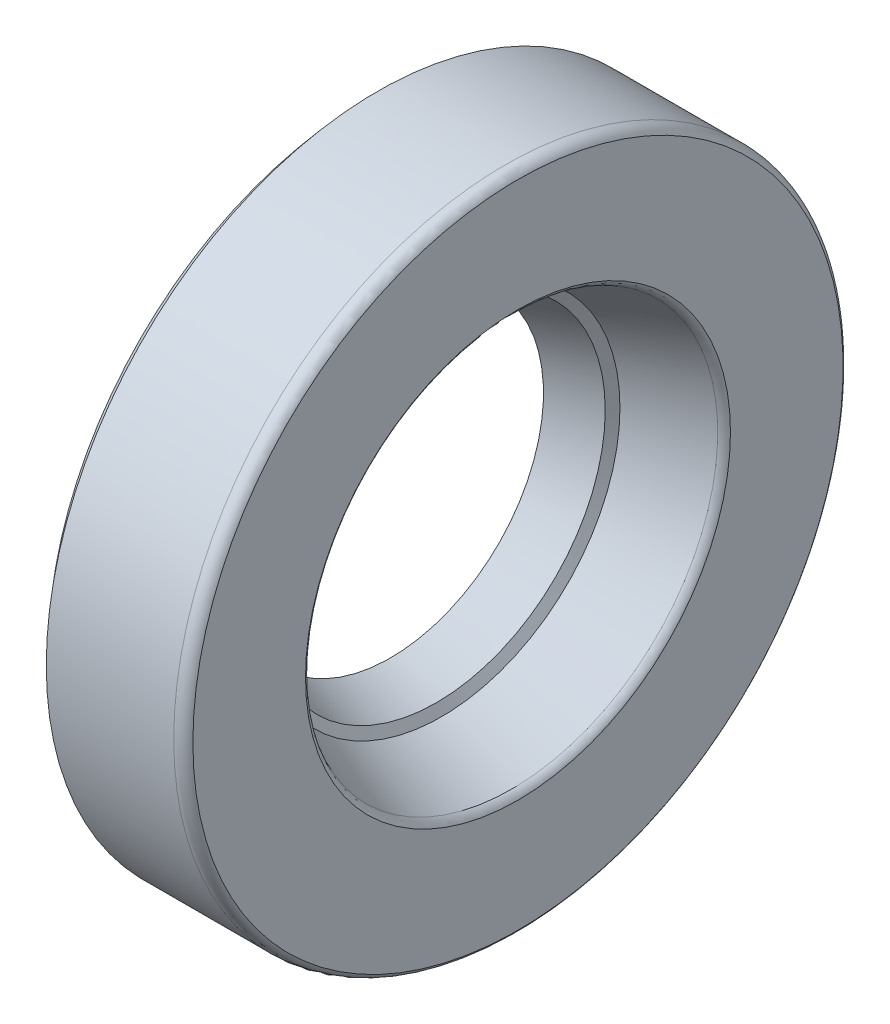
ISO-10303-21;
HEADER;
FILE_DESCRIPTION(('STEP AP214'),'2;1');
FILE_NAME('part.step','',(''),(''),'','','');
FILE_SCHEMA(('AUTOMOTIVE_DESIGN { 1 0 10303 214 1 1 1 1 }'));
ENDSEC;
DATA;
#1=APPLICATION_CONTEXT('core data for automotive mechanical design processes');
#2=APPLICATION_PROTOCOL_DEFINITION('international standard','automotive_design',2000,#1);
#3=PRODUCT_CONTEXT('',#1,'mechanical');
#4=PRODUCT('Part','Part','',(#3));
#5=PRODUCT_RELATED_PRODUCT_CATEGORY('part','',(#4));
#6=PRODUCT_DEFINITION_FORMATION('','',#4);
#7=PRODUCT_DEFINITION_CONTEXT('part definition',#1,'design');
#8=PRODUCT_DEFINITION('design','',#6,#7);
#9=PRODUCT_DEFINITION_SHAPE('','',#8);
#10=(LENGTH_UNIT() NAMED_UNIT(*) SI_UNIT(.MILLI.,.METRE.));
#11=(NAMED_UNIT(*) PLANE_ANGLE_UNIT() SI_UNIT($,.RADIAN.));
#12=(NAMED_UNIT(*) SI_UNIT($,.STERADIAN.) SOLID_ANGLE_UNIT());
#13=UNCERTAINTY_MEASURE_WITH_UNIT(LENGTH_MEASURE(1.E-05),#10,'distance_accuracy_value','');
#14=(GEOMETRIC_REPRESENTATION_CONTEXT(3) GLOBAL_UNCERTAINTY_ASSIGNED_CONTEXT((#13)) GLOBAL_UNIT_ASSIGNED_CONTEXT((#10,
#11,#12)) REPRESENTATION_CONTEXT('',''));
#15=CARTESIAN_POINT('',(0.,0.,0.));
#16=DIRECTION('',(0.,0.,1.));
#17=DIRECTION('',(1.,0.,0.));
#18=AXIS2_PLACEMENT_3D('',#15,#16,#17);
#19=CARTESIAN_POINT('',(0.,0.,0.));
#20=DIRECTION('',(-1.,0.,0.));
#21=DIRECTION('',(0.,0.,1.));
#22=AXIS2_PLACEMENT_3D('',#19,#20,#21);
#23=CYLINDRICAL_SURFACE('',#22,13.);
#24=CARTESIAN_POINT('',(5.50000000000001,0.,0.));
#25=DIRECTION('',(-1.,0.,0.));
#26=DIRECTION('',(0.,0.,1.));
#27=AXIS2_PLACEMENT_3D('',#24,#25,#26);
#28=CIRCLE('',#27,13.);
#29=CARTESIAN_POINT('',(5.50000000000001,0.,13.));
#30=VERTEX_POINT('',#29);
#31=EDGE_CURVE('E10',#30,#30,#28,.T.);
#32=ORIENTED_EDGE('',*,*,#31,.T.);
#33=EDGE_LOOP('',(#32));
#34=FACE_BOUND('',#33,.T.);
#35=CARTESIAN_POINT('',(0.5,0.,0.));
#36=DIRECTION('',(-1.,0.,0.));
#37=DIRECTION('',(0.,0.,1.));
#38=AXIS2_PLACEMENT_3D('',#35,#36,#37);
#39=CIRCLE('',#38,13.);
#40=CARTESIAN_POINT('',(0.5,0.,13.));
#41=VERTEX_POINT('',#40);
#42=EDGE_CURVE('E85',#41,#41,#39,.T.);
#43=ORIENTED_EDGE('',*,*,#42,.F.);
#44=EDGE_LOOP('',(#43));
#45=FACE_BOUND('',#44,.T.);
#46=ADVANCED_FACE('F30',(#34,#45),#23,.T.);
#47=CARTESIAN_POINT('',(5.56459503782261,0.,0.));
#48=DIRECTION('',(-1.,0.,0.));
#49=DIRECTION('',(0.,0.,1.));
#50=AXIS2_PLACEMENT_3D('',#47,#48,#49);
#51=TOROIDAL_SURFACE('',#50,12.5041900756452,0.5);
#52=ORIENTED_EDGE('',*,*,#31,.F.);
#53=EDGE_LOOP('',(#52));
#54=FACE_BOUND('',#53,.T.);
#55=CARTESIAN_POINT('',(6.00000000000001,0.,0.));
#56=DIRECTION('',(-1.,0.,0.));
#57=DIRECTION('',(0.,0.,1.));
#58=AXIS2_PLACEMENT_3D('',#55,#56,#57);
#59=CIRCLE('',#58,12.75);
#60=CARTESIAN_POINT('',(6.00000000000001,0.,12.75));
#61=VERTEX_POINT('',#60);
#62=EDGE_CURVE('E36',#61,#61,#59,.T.);
#63=ORIENTED_EDGE('',*,*,#62,.T.);
#64=EDGE_LOOP('',(#63));
#65=FACE_BOUND('',#64,.T.);
#66=ADVANCED_FACE('F93',(#54,#65),#51,.T.);
#67=CARTESIAN_POINT('',(5.99999999999999,12.75,0.));
#68=DIRECTION('',(1.,0.,0.));
#69=DIRECTION('',(0.,0.,-1.));
#70=AXIS2_PLACEMENT_3D('',#67,#68,#69);
#71=PLANE('',#70);
#72=CARTESIAN_POINT('',(6.00000000000001,0.,0.));
#73=DIRECTION('',(-1.,0.,0.));
#74=DIRECTION('',(0.,0.,1.));
#75=AXIS2_PLACEMENT_3D('',#72,#73,#74);
#76=CIRCLE('',#75,8.33333333333334);
#77=CARTESIAN_POINT('',(6.00000000000001,0.,8.33333333333335));
#78=VERTEX_POINT('',#77);
#79=EDGE_CURVE('E40',#78,#78,#76,.T.);
#80=ORIENTED_EDGE('',*,*,#79,.T.);
#81=EDGE_LOOP('',(#80));
#82=FACE_BOUND('',#81,.T.);
#83=ORIENTED_EDGE('',*,*,#62,.F.);
#84=EDGE_LOOP('',(#83));
#85=FACE_BOUND('',#84,.T.);
#86=ADVANCED_FACE('F97',(#82,#85),#71,.T.);
#87=CARTESIAN_POINT('',(5.54428108611693,0.,0.));
#88=DIRECTION('',(-1.,0.,0.));
#89=DIRECTION('',(0.,0.,1.));
#90=AXIS2_PLACEMENT_3D('',#87,#88,#89);
#91=TOROIDAL_SURFACE('',#90,8.53905224721641,0.5);
#92=ORIENTED_EDGE('',*,*,#79,.F.);
#93=EDGE_LOOP('',(#92));
#94=FACE_BOUND('',#93,.T.);
#95=CARTESIAN_POINT('',(5.75000000000001,0.,0.));
#96=DIRECTION('',(-1.,0.,0.));
#97=DIRECTION('',(0.,0.,1.));
#98=AXIS2_PLACEMENT_3D('',#95,#96,#97);
#99=CIRCLE('',#98,8.08333333333334);
#100=CARTESIAN_POINT('',(5.75000000000001,0.,8.08333333333335));
#101=VERTEX_POINT('',#100);
#102=EDGE_CURVE('E44',#101,#101,#99,.T.);
#103=ORIENTED_EDGE('',*,*,#102,.T.);
#104=EDGE_LOOP('',(#103));
#105=FACE_BOUND('',#104,.T.);
#106=ADVANCED_FACE('F102',(#94,#105),#91,.T.);
#107=CARTESIAN_POINT('',(5.75000000000001,0.,0.));
#108=DIRECTION('',(1.,0.,0.));
#109=DIRECTION('',(0.,0.,-1.));
#110=AXIS2_PLACEMENT_3D('',#107,#108,#109);
#111=CONICAL_SURFACE('',#110,8.08333333333334,0.375270822855958);
#112=CARTESIAN_POINT('',(3.,0.,0.));
#113=DIRECTION('',(-1.,0.,0.));
#114=DIRECTION('',(0.,0.,1.));
#115=AXIS2_PLACEMENT_3D('',#112,#113,#114);
#116=CIRCLE('',#115,7.);
#117=CARTESIAN_POINT('',(3.,0.,7.00000000000001));
#118=VERTEX_POINT('',#117);
#119=EDGE_CURVE('E49',#118,#118,#116,.T.);
#120=ORIENTED_EDGE('',*,*,#119,.T.);
#121=EDGE_LOOP('',(#120));
#122=FACE_BOUND('',#121,.T.);
#123=ORIENTED_EDGE('',*,*,#102,.F.);
#124=EDGE_LOOP('',(#123));
#125=FACE_BOUND('',#124,.T.);
#126=ADVANCED_FACE('F108',(#122,#125),#111,.F.);
#127=CARTESIAN_POINT('',(3.,0.,0.));
#128=DIRECTION('',(1.,0.,0.));
#129=DIRECTION('',(0.,0.,-1.));
#130=AXIS2_PLACEMENT_3D('',#127,#128,#129);
#131=CONICAL_SURFACE('',#130,7.,1.08389709498363);
#132=CARTESIAN_POINT('',(2.8,0.,0.));
#133=DIRECTION('',(-1.,0.,0.));
#134=DIRECTION('',(0.,0.,1.));
#135=AXIS2_PLACEMENT_3D('',#132,#133,#134);
#136=CIRCLE('',#135,6.62222222222222);
#137=CARTESIAN_POINT('',(2.8,0.,6.62222222222223));
#138=VERTEX_POINT('',#137);
#139=EDGE_CURVE('E52',#138,#138,#136,.T.);
#140=ORIENTED_EDGE('',*,*,#139,.T.);
#141=EDGE_LOOP('',(#140));
#142=FACE_BOUND('',#141,.T.);
#143=ORIENTED_EDGE('',*,*,#119,.F.);
#144=EDGE_LOOP('',(#143));
#145=FACE_BOUND('',#144,.T.);
#146=ADVANCED_FACE('F112',(#142,#145),#131,.F.);
#147=CARTESIAN_POINT('',(2.8,0.,0.));
#148=DIRECTION('',(1.,0.,0.));
#149=DIRECTION('',(0.,0.,-1.));
#150=AXIS2_PLACEMENT_3D('',#147,#148,#149);
#151=CONICAL_SURFACE('',#150,6.62222222222222,0.332820212926749);
#152=CARTESIAN_POINT('',(1.,0.,0.));
#153=DIRECTION('',(-1.,0.,0.));
#154=DIRECTION('',(0.,0.,1.));
#155=AXIS2_PLACEMENT_3D('',#152,#153,#154);
#156=CIRCLE('',#155,6.);
#157=CARTESIAN_POINT('',(1.,0.,6.00000000000001));
#158=VERTEX_POINT('',#157);
#159=EDGE_CURVE('E55',#158,#158,#156,.T.);
#160=ORIENTED_EDGE('',*,*,#159,.T.);
#161=EDGE_LOOP('',(#160));
#162=FACE_BOUND('',#161,.T.);
#163=ORIENTED_EDGE('',*,*,#139,.F.);
#164=EDGE_LOOP('',(#163));
#165=FACE_BOUND('',#164,.T.);
#166=ADVANCED_FACE('F116',(#162,#165),#151,.F.);
#167=CARTESIAN_POINT('',(1.,0.,0.));
#168=DIRECTION('',(-1.,0.,0.));
#169=DIRECTION('',(0.,0.,1.));
#170=AXIS2_PLACEMENT_3D('',#167,#168,#169);
#171=CONICAL_SURFACE('',#170,6.,1.03037682652431);
#172=CARTESIAN_POINT('',(0.399999999999998,0.,0.));
#173=DIRECTION('',(-1.,0.,0.));
#174=DIRECTION('',(0.,0.,1.));
#175=AXIS2_PLACEMENT_3D('',#172,#173,#174);
#176=CIRCLE('',#175,7.);
#177=CARTESIAN_POINT('',(0.399999999999998,0.,7.00000000000001));
#178=VERTEX_POINT('',#177);
#179=EDGE_CURVE('E58',#178,#178,#176,.T.);
#180=ORIENTED_EDGE('',*,*,#179,.T.);
#181=EDGE_LOOP('',(#180));
#182=FACE_BOUND('',#181,.T.);
#183=ORIENTED_EDGE('',*,*,#159,.F.);
#184=EDGE_LOOP('',(#183));
#185=FACE_BOUND('',#184,.T.);
#186=ADVANCED_FACE('F120',(#182,#185),#171,.F.);
#187=CARTESIAN_POINT('',(0.399999999999998,6.99999999999999,0.));
#188=DIRECTION('',(-1.,0.,0.));
#189=DIRECTION('',(0.,0.,1.));
#190=AXIS2_PLACEMENT_3D('',#187,#188,#189);
#191=PLANE('',#190);
#192=CARTESIAN_POINT('',(0.399999999999998,0.,0.));
#193=DIRECTION('',(-1.,0.,0.));
#194=DIRECTION('',(0.,0.,1.));
#195=AXIS2_PLACEMENT_3D('',#192,#193,#194);
#196=CIRCLE('',#195,8.47908332857089);
#197=CARTESIAN_POINT('',(0.399999999999998,0.,8.4790833285709));
#198=VERTEX_POINT('',#197);
#199=EDGE_CURVE('E61',#198,#198,#196,.T.);
#200=ORIENTED_EDGE('',*,*,#199,.T.);
#201=EDGE_LOOP('',(#200));
#202=FACE_BOUND('',#201,.T.);
#203=ORIENTED_EDGE('',*,*,#179,.F.);
#204=EDGE_LOOP('',(#203));
#205=FACE_BOUND('',#204,.T.);
#206=ADVANCED_FACE('F124',(#202,#205),#191,.T.);
#207=CARTESIAN_POINT('',(0.,0.,0.));
#208=DIRECTION('',(-1.,0.,0.));
#209=DIRECTION('',(0.,0.,1.));
#210=AXIS2_PLACEMENT_3D('',#207,#208,#209);
#211=CYLINDRICAL_SURFACE('',#210,8.47908332857089);
#212=CARTESIAN_POINT('',(1.14688882770436,0.,0.));
#213=DIRECTION('',(-1.,0.,0.));
#214=DIRECTION('',(0.,0.,1.));
#215=AXIS2_PLACEMENT_3D('',#212,#213,#214);
#216=CIRCLE('',#215,8.47908332857089);
#217=CARTESIAN_POINT('',(1.14688882770436,0.,8.4790833285709));
#218=VERTEX_POINT('',#217);
#219=EDGE_CURVE('E64',#218,#218,#216,.T.);
#220=ORIENTED_EDGE('',*,*,#219,.T.);
#221=EDGE_LOOP('',(#220));
#222=FACE_BOUND('',#221,.T.);
#223=ORIENTED_EDGE('',*,*,#199,.F.);
#224=EDGE_LOOP('',(#223));
#225=FACE_BOUND('',#224,.T.);
#226=ADVANCED_FACE('F128',(#222,#225),#211,.T.);
#227=CARTESIAN_POINT('',(1.5,0.,0.));
#228=DIRECTION('',(-1.,0.,0.));
#229=DIRECTION('',(0.,0.,1.));
#230=AXIS2_PLACEMENT_3D('',#227,#228,#229);
#231=TOROIDAL_SURFACE('',#230,7.75,0.810092587300983);
#232=ORIENTED_EDGE('',*,*,#219,.F.);
#233=EDGE_LOOP('',(#232));
#234=FACE_BOUND('',#233,.T.);
#235=CARTESIAN_POINT('',(2.28053871632296,0.,0.));
#236=DIRECTION('',(-1.,0.,0.));
#237=DIRECTION('',(0.,0.,1.));
#238=AXIS2_PLACEMENT_3D('',#235,#236,#237);
#239=CIRCLE('',#238,7.96681631008971);
#240=CARTESIAN_POINT('',(2.28053871632296,0.,7.96681631008972));
#241=VERTEX_POINT('',#240);
#242=EDGE_CURVE('E67',#241,#241,#239,.T.);
#243=ORIENTED_EDGE('',*,*,#242,.T.);
#244=EDGE_LOOP('',(#243));
#245=FACE_BOUND('',#244,.T.);
#246=ADVANCED_FACE('F132',(#234,#245),#231,.T.);
#247=CARTESIAN_POINT('',(3.60000000000001,0.,0.));
#248=DIRECTION('',(1.,0.,0.));
#249=DIRECTION('',(0.,0.,-1.));
#250=AXIS2_PLACEMENT_3D('',#247,#248,#249);
#251=CONICAL_SURFACE('',#250,8.33333333333334,0.270946850338421);
#252=ORIENTED_EDGE('',*,*,#242,.F.);
#253=EDGE_LOOP('',(#252));
#254=FACE_BOUND('',#253,.T.);
#255=CARTESIAN_POINT('',(3.60000000000001,0.,0.));
#256=DIRECTION('',(-1.,0.,0.));
#257=DIRECTION('',(0.,0.,1.));
#258=AXIS2_PLACEMENT_3D('',#255,#256,#257);
#259=CIRCLE('',#258,8.33333333333334);
#260=CARTESIAN_POINT('',(3.60000000000001,0.,8.33333333333335));
#261=VERTEX_POINT('',#260);
#262=EDGE_CURVE('E70',#261,#261,#259,.T.);
#263=ORIENTED_EDGE('',*,*,#262,.T.);
#264=EDGE_LOOP('',(#263));
#265=FACE_BOUND('',#264,.T.);
#266=ADVANCED_FACE('F136',(#254,#265),#251,.T.);
#267=CARTESIAN_POINT('',(3.59999999999999,11.,0.));
#268=DIRECTION('',(1.,0.,0.));
#269=DIRECTION('',(0.,0.,-1.));
#270=AXIS2_PLACEMENT_3D('',#267,#268,#269);
#271=PLANE('',#270);
#272=ORIENTED_EDGE('',*,*,#262,.F.);
#273=EDGE_LOOP('',(#272));
#274=FACE_BOUND('',#273,.T.);
#275=CARTESIAN_POINT('',(3.60000000000001,0.,0.));
#276=DIRECTION('',(-1.,0.,0.));
#277=DIRECTION('',(0.,0.,1.));
#278=AXIS2_PLACEMENT_3D('',#275,#276,#277);
#279=CIRCLE('',#278,11.);
#280=CARTESIAN_POINT('',(3.60000000000001,0.,11.));
#281=VERTEX_POINT('',#280);
#282=EDGE_CURVE('E73',#281,#281,#279,.T.);
#283=ORIENTED_EDGE('',*,*,#282,.T.);
#284=EDGE_LOOP('',(#283));
#285=FACE_BOUND('',#284,.T.);
#286=ADVANCED_FACE('F140',(#274,#285),#271,.F.);
#287=CARTESIAN_POINT('',(3.14428108611693,0.,0.));
#288=DIRECTION('',(-1.,0.,0.));
#289=DIRECTION('',(0.,0.,1.));
#290=AXIS2_PLACEMENT_3D('',#287,#288,#289);
#291=TOROIDAL_SURFACE('',#290,10.7942810861169,0.5);
#292=CARTESIAN_POINT('',(3.35000000000001,0.,0.));
#293=DIRECTION('',(-1.,0.,0.));
#294=DIRECTION('',(0.,0.,1.));
#295=AXIS2_PLACEMENT_3D('',#292,#293,#294);
#296=CIRCLE('',#295,11.25);
#297=CARTESIAN_POINT('',(3.35000000000001,0.,11.25));
#298=VERTEX_POINT('',#297);
#299=EDGE_CURVE('E76',#298,#298,#296,.T.);
#300=ORIENTED_EDGE('',*,*,#299,.T.);
#301=EDGE_LOOP('',(#300));
#302=FACE_BOUND('',#301,.T.);
#303=ORIENTED_EDGE('',*,*,#282,.F.);
#304=EDGE_LOOP('',(#303));
#305=FACE_BOUND('',#304,.T.);
#306=ADVANCED_FACE('F144',(#302,#305),#291,.F.);
#307=CARTESIAN_POINT('',(0.,0.,0.));
#308=DIRECTION('',(-1.,0.,0.));
#309=DIRECTION('',(0.,0.,1.));
#310=AXIS2_PLACEMENT_3D('',#307,#308,#309);
#311=CONICAL_SURFACE('',#310,11.6,0.1040999381096);
#312=ORIENTED_EDGE('',*,*,#299,.F.);
#313=EDGE_LOOP('',(#312));
#314=FACE_BOUND('',#313,.T.);
#315=CARTESIAN_POINT('',(0.,0.,0.));
#316=DIRECTION('',(-1.,0.,0.));
#317=DIRECTION('',(0.,0.,1.));
#318=AXIS2_PLACEMENT_3D('',#315,#316,#317);
#319=CIRCLE('',#318,11.6);
#320=CARTESIAN_POINT('',(0.,0.,11.6));
#321=VERTEX_POINT('',#320);
#322=EDGE_CURVE('E79',#321,#321,#319,.T.);
#323=ORIENTED_EDGE('',*,*,#322,.T.);
#324=EDGE_LOOP('',(#323));
#325=FACE_BOUND('',#324,.T.);
#326=ADVANCED_FACE('F148',(#314,#325),#311,.F.);
#327=CARTESIAN_POINT('',(0.,11.6,0.));
#328=DIRECTION('',(-1.,0.,0.));
#329=DIRECTION('',(0.,0.,1.));
#330=AXIS2_PLACEMENT_3D('',#327,#328,#329);
#331=PLANE('',#330);
#332=CARTESIAN_POINT('',(0.,0.,0.));
#333=DIRECTION('',(-1.,0.,0.));
#334=DIRECTION('',(0.,0.,1.));
#335=AXIS2_PLACEMENT_3D('',#332,#333,#334);
#336=CIRCLE('',#335,12.4166666666667);
#337=CARTESIAN_POINT('',(0.,0.,12.4166666666667));
#338=VERTEX_POINT('',#337);
#339=EDGE_CURVE('E82',#338,#338,#336,.T.);
#340=ORIENTED_EDGE('',*,*,#339,.T.);
#341=EDGE_LOOP('',(#340));
#342=FACE_BOUND('',#341,.T.);
#343=ORIENTED_EDGE('',*,*,#322,.F.);
#344=EDGE_LOOP('',(#343));
#345=FACE_BOUND('',#344,.T.);
#346=ADVANCED_FACE('F152',(#342,#345),#331,.T.);
#347=CARTESIAN_POINT('',(0.,0.,0.));
#348=DIRECTION('',(1.,0.,0.));
#349=DIRECTION('',(0.,0.,-1.));
#350=AXIS2_PLACEMENT_3D('',#347,#348,#349);
#351=CONICAL_SURFACE('',#350,12.4166666666667,0.862170054667226);
#352=ORIENTED_EDGE('',*,*,#42,.T.);
#353=EDGE_LOOP('',(#352));
#354=FACE_BOUND('',#353,.T.);
#355=ORIENTED_EDGE('',*,*,#339,.F.);
#356=EDGE_LOOP('',(#355));
#357=FACE_BOUND('',#356,.T.);
#358=ADVANCED_FACE('F89',(#354,#357),#351,.T.);
#359=CLOSED_SHELL('',(#46,#66,#86,#106,#126,#146,#166,#186,#206,#226,#246,#266,#286,#306,#326,
#346,#358));
#360=MANIFOLD_SOLID_BREP('B2',#359);
#361=ADVANCED_BREP_SHAPE_REPRESENTATION('',(#18,#360),#14);
#362=SHAPE_DEFINITION_REPRESENTATION(#9,#361);
ENDSEC;
END-ISO-10303-21;
